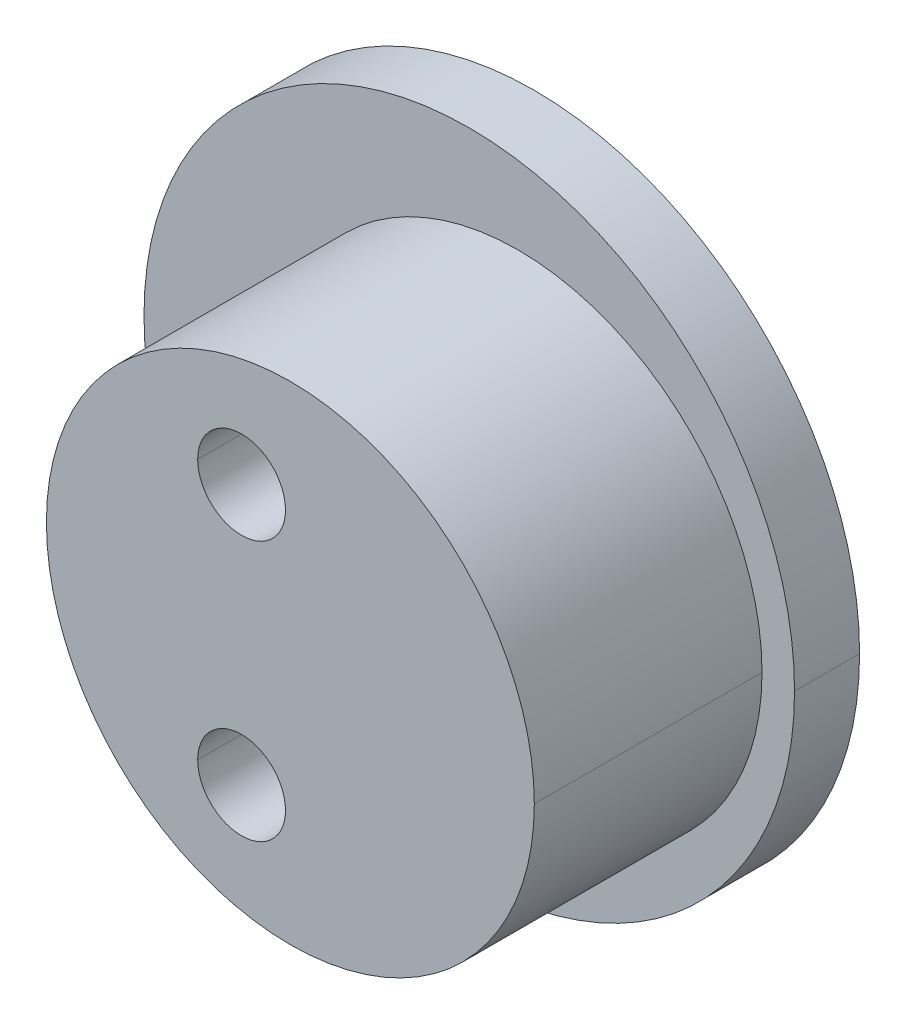
ISO-10303-21;
HEADER;
FILE_DESCRIPTION(('STEP AP214'),'2;1');
FILE_NAME('part.step','',(''),(''),'','','');
FILE_SCHEMA(('AUTOMOTIVE_DESIGN { 1 0 10303 214 1 1 1 1 }'));
ENDSEC;
DATA;
#1=APPLICATION_CONTEXT('core data for automotive mechanical design processes');
#2=APPLICATION_PROTOCOL_DEFINITION('international standard','automotive_design',2000,#1);
#3=PRODUCT_CONTEXT('',#1,'mechanical');
#4=PRODUCT('Part','Part','',(#3));
#5=PRODUCT_RELATED_PRODUCT_CATEGORY('part','',(#4));
#6=PRODUCT_DEFINITION_FORMATION('','',#4);
#7=PRODUCT_DEFINITION_CONTEXT('part definition',#1,'design');
#8=PRODUCT_DEFINITION('design','',#6,#7);
#9=PRODUCT_DEFINITION_SHAPE('','',#8);
#10=(LENGTH_UNIT() NAMED_UNIT(*) SI_UNIT(.MILLI.,.METRE.));
#11=(NAMED_UNIT(*) PLANE_ANGLE_UNIT() SI_UNIT($,.RADIAN.));
#12=(NAMED_UNIT(*) SI_UNIT($,.STERADIAN.) SOLID_ANGLE_UNIT());
#13=UNCERTAINTY_MEASURE_WITH_UNIT(LENGTH_MEASURE(1.E-05),#10,'distance_accuracy_value','');
#14=(GEOMETRIC_REPRESENTATION_CONTEXT(3) GLOBAL_UNCERTAINTY_ASSIGNED_CONTEXT((#13)) GLOBAL_UNIT_ASSIGNED_CONTEXT((#10,
#11,#12)) REPRESENTATION_CONTEXT('',''));
#15=CARTESIAN_POINT('',(0.,0.,0.));
#16=DIRECTION('',(0.,0.,1.));
#17=DIRECTION('',(1.,0.,0.));
#18=AXIS2_PLACEMENT_3D('',#15,#16,#17);
#19=CARTESIAN_POINT('',(0.,4.,0.));
#20=DIRECTION('',(0.,0.,1.));
#21=DIRECTION('',(1.,0.,0.));
#22=AXIS2_PLACEMENT_3D('',#19,#20,#21);
#23=CYLINDRICAL_SURFACE('',#22,1.35);
#24=DIRECTION('',(0.,0.,1.));
#25=VECTOR('',#24,1.);
#26=CARTESIAN_POINT('',(-1.35,4.,0.));
#27=LINE('',#26,#25);
#28=CARTESIAN_POINT('',(-1.35,4.,0.));
#29=VERTEX_POINT('',#28);
#30=CARTESIAN_POINT('',(-1.35,4.,9.));
#31=VERTEX_POINT('',#30);
#32=EDGE_CURVE('E132',#29,#31,#27,.T.);
#33=ORIENTED_EDGE('',*,*,#32,.F.);
#34=CARTESIAN_POINT('',(0.,4.,0.));
#35=DIRECTION('',(0.,0.,1.));
#36=DIRECTION('',(1.,0.,0.));
#37=AXIS2_PLACEMENT_3D('',#34,#35,#36);
#38=CIRCLE('',#37,1.35);
#39=CARTESIAN_POINT('',(1.35,4.,0.));
#40=VERTEX_POINT('',#39);
#41=EDGE_CURVE('E169',#40,#29,#38,.T.);
#42=ORIENTED_EDGE('',*,*,#41,.F.);
#43=DIRECTION('',(0.,0.,1.));
#44=VECTOR('',#43,1.);
#45=CARTESIAN_POINT('',(1.35,4.,0.));
#46=LINE('',#45,#44);
#47=CARTESIAN_POINT('',(1.35,4.,9.));
#48=VERTEX_POINT('',#47);
#49=EDGE_CURVE('E146',#40,#48,#46,.T.);
#50=ORIENTED_EDGE('',*,*,#49,.T.);
#51=CARTESIAN_POINT('',(0.,4.,9.));
#52=DIRECTION('',(0.,0.,1.));
#53=DIRECTION('',(1.,0.,0.));
#54=AXIS2_PLACEMENT_3D('',#51,#52,#53);
#55=CIRCLE('',#54,1.35);
#56=EDGE_CURVE('E27',#48,#31,#55,.T.);
#57=ORIENTED_EDGE('',*,*,#56,.T.);
#58=EDGE_LOOP('',(#33,#42,#50,#57));
#59=FACE_BOUND('',#58,.T.);
#60=ADVANCED_FACE('F17',(#59),#23,.F.);
#61=CARTESIAN_POINT('',(0.,-4.,0.));
#62=DIRECTION('',(0.,0.,1.));
#63=DIRECTION('',(1.,0.,0.));
#64=AXIS2_PLACEMENT_3D('',#61,#62,#63);
#65=CYLINDRICAL_SURFACE('',#64,1.35);
#66=DIRECTION('',(0.,0.,1.));
#67=VECTOR('',#66,1.);
#68=CARTESIAN_POINT('',(-1.35,-4.,0.));
#69=LINE('',#68,#67);
#70=CARTESIAN_POINT('',(-1.35,-4.,0.));
#71=VERTEX_POINT('',#70);
#72=CARTESIAN_POINT('',(-1.35,-4.,9.));
#73=VERTEX_POINT('',#72);
#74=EDGE_CURVE('E133',#71,#73,#69,.T.);
#75=ORIENTED_EDGE('',*,*,#74,.F.);
#76=CARTESIAN_POINT('',(0.,-4.,0.));
#77=DIRECTION('',(0.,0.,1.));
#78=DIRECTION('',(1.,0.,0.));
#79=AXIS2_PLACEMENT_3D('',#76,#77,#78);
#80=CIRCLE('',#79,1.35);
#81=CARTESIAN_POINT('',(1.35,-4.,0.));
#82=VERTEX_POINT('',#81);
#83=EDGE_CURVE('E165',#82,#71,#80,.T.);
#84=ORIENTED_EDGE('',*,*,#83,.F.);
#85=DIRECTION('',(0.,0.,1.));
#86=VECTOR('',#85,1.);
#87=CARTESIAN_POINT('',(1.35,-4.,0.));
#88=LINE('',#87,#86);
#89=CARTESIAN_POINT('',(1.35,-4.,9.));
#90=VERTEX_POINT('',#89);
#91=EDGE_CURVE('E156',#82,#90,#88,.T.);
#92=ORIENTED_EDGE('',*,*,#91,.T.);
#93=CARTESIAN_POINT('',(0.,-4.,9.));
#94=DIRECTION('',(0.,0.,1.));
#95=DIRECTION('',(1.,0.,0.));
#96=AXIS2_PLACEMENT_3D('',#93,#94,#95);
#97=CIRCLE('',#96,1.35);
#98=EDGE_CURVE('E11',#90,#73,#97,.T.);
#99=ORIENTED_EDGE('',*,*,#98,.T.);
#100=EDGE_LOOP('',(#75,#84,#92,#99));
#101=FACE_BOUND('',#100,.T.);
#102=ADVANCED_FACE('F19',(#101),#65,.F.);
#103=CARTESIAN_POINT('',(1.5,0.,9.));
#104=DIRECTION('',(0.,0.,1.));
#105=DIRECTION('',(1.,0.,0.));
#106=AXIS2_PLACEMENT_3D('',#103,#104,#105);
#107=PLANE('',#106);
#108=ORIENTED_EDGE('',*,*,#98,.F.);
#109=CARTESIAN_POINT('',(0.,-4.,9.));
#110=DIRECTION('',(0.,0.,1.));
#111=DIRECTION('',(1.,0.,0.));
#112=AXIS2_PLACEMENT_3D('',#109,#110,#111);
#113=CIRCLE('',#112,1.35);
#114=EDGE_CURVE('E137',#73,#90,#113,.T.);
#115=ORIENTED_EDGE('',*,*,#114,.F.);
#116=EDGE_LOOP('',(#108,#115));
#117=FACE_BOUND('',#116,.T.);
#118=ORIENTED_EDGE('',*,*,#56,.F.);
#119=CARTESIAN_POINT('',(0.,4.,9.));
#120=DIRECTION('',(0.,0.,1.));
#121=DIRECTION('',(1.,0.,0.));
#122=AXIS2_PLACEMENT_3D('',#119,#120,#121);
#123=CIRCLE('',#122,1.35);
#124=EDGE_CURVE('E142',#31,#48,#123,.T.);
#125=ORIENTED_EDGE('',*,*,#124,.F.);
#126=EDGE_LOOP('',(#118,#125));
#127=FACE_BOUND('',#126,.T.);
#128=CARTESIAN_POINT('',(1.5,0.,9.));
#129=DIRECTION('',(0.,0.,1.));
#130=DIRECTION('',(1.,0.,0.));
#131=AXIS2_PLACEMENT_3D('',#128,#129,#130);
#132=CIRCLE('',#131,7.5);
#133=CARTESIAN_POINT('',(-6.,0.,9.));
#134=VERTEX_POINT('',#133);
#135=CARTESIAN_POINT('',(9.,0.,9.));
#136=VERTEX_POINT('',#135);
#137=EDGE_CURVE('E168',#134,#136,#132,.T.);
#138=ORIENTED_EDGE('',*,*,#137,.T.);
#139=CARTESIAN_POINT('',(1.5,0.,9.));
#140=DIRECTION('',(0.,0.,1.));
#141=DIRECTION('',(1.,0.,0.));
#142=AXIS2_PLACEMENT_3D('',#139,#140,#141);
#143=CIRCLE('',#142,7.5);
#144=EDGE_CURVE('E160',#136,#134,#143,.T.);
#145=ORIENTED_EDGE('',*,*,#144,.T.);
#146=EDGE_LOOP('',(#138,#145));
#147=FACE_BOUND('',#146,.T.);
#148=ADVANCED_FACE('F196',(#117,#127,#147),#107,.T.);
#149=CARTESIAN_POINT('',(1.5,0.,9.));
#150=DIRECTION('',(0.,0.,-1.));
#151=DIRECTION('',(-1.,0.,0.));
#152=AXIS2_PLACEMENT_3D('',#149,#150,#151);
#153=CYLINDRICAL_SURFACE('',#152,7.5);
#154=DIRECTION('',(0.,0.,-1.));
#155=VECTOR('',#154,1.);
#156=CARTESIAN_POINT('',(9.,0.,9.));
#157=LINE('',#156,#155);
#158=CARTESIAN_POINT('',(9.,0.,2.));
#159=VERTEX_POINT('',#158);
#160=EDGE_CURVE('E164',#136,#159,#157,.T.);
#161=ORIENTED_EDGE('',*,*,#160,.F.);
#162=ORIENTED_EDGE('',*,*,#137,.F.);
#163=DIRECTION('',(0.,0.,-1.));
#164=VECTOR('',#163,1.);
#165=CARTESIAN_POINT('',(-6.,0.,9.));
#166=LINE('',#165,#164);
#167=CARTESIAN_POINT('',(-6.,0.,2.));
#168=VERTEX_POINT('',#167);
#169=EDGE_CURVE('E117',#134,#168,#166,.T.);
#170=ORIENTED_EDGE('',*,*,#169,.T.);
#171=CARTESIAN_POINT('',(1.5,0.,2.));
#172=DIRECTION('',(0.,0.,1.));
#173=DIRECTION('',(1.,0.,0.));
#174=AXIS2_PLACEMENT_3D('',#171,#172,#173);
#175=CIRCLE('',#174,7.5);
#176=EDGE_CURVE('E180',#168,#159,#175,.T.);
#177=ORIENTED_EDGE('',*,*,#176,.T.);
#178=EDGE_LOOP('',(#161,#162,#170,#177));
#179=FACE_BOUND('',#178,.T.);
#180=ADVANCED_FACE('F203',(#179),#153,.T.);
#181=CARTESIAN_POINT('',(0.,0.,0.));
#182=DIRECTION('',(0.,0.,1.));
#183=DIRECTION('',(1.,0.,0.));
#184=AXIS2_PLACEMENT_3D('',#181,#182,#183);
#185=PLANE('',#184);
#186=ORIENTED_EDGE('',*,*,#83,.T.);
#187=CARTESIAN_POINT('',(0.,-4.,0.));
#188=DIRECTION('',(0.,0.,1.));
#189=DIRECTION('',(1.,0.,0.));
#190=AXIS2_PLACEMENT_3D('',#187,#188,#189);
#191=CIRCLE('',#190,1.35);
#192=EDGE_CURVE('E138',#71,#82,#191,.T.);
#193=ORIENTED_EDGE('',*,*,#192,.T.);
#194=EDGE_LOOP('',(#186,#193));
#195=FACE_BOUND('',#194,.T.);
#196=ORIENTED_EDGE('',*,*,#41,.T.);
#197=CARTESIAN_POINT('',(0.,4.,0.));
#198=DIRECTION('',(0.,0.,1.));
#199=DIRECTION('',(1.,0.,0.));
#200=AXIS2_PLACEMENT_3D('',#197,#198,#199);
#201=CIRCLE('',#200,1.35);
#202=EDGE_CURVE('E128',#29,#40,#201,.T.);
#203=ORIENTED_EDGE('',*,*,#202,.T.);
#204=EDGE_LOOP('',(#196,#203));
#205=FACE_BOUND('',#204,.T.);
#206=CARTESIAN_POINT('',(0.,0.,0.));
#207=DIRECTION('',(0.,0.,1.));
#208=DIRECTION('',(1.,0.,0.));
#209=AXIS2_PLACEMENT_3D('',#206,#207,#208);
#210=CIRCLE('',#209,10.);
#211=CARTESIAN_POINT('',(-10.,0.,0.));
#212=VERTEX_POINT('',#211);
#213=CARTESIAN_POINT('',(10.,0.,0.));
#214=VERTEX_POINT('',#213);
#215=EDGE_CURVE('E39',#212,#214,#210,.T.);
#216=ORIENTED_EDGE('',*,*,#215,.F.);
#217=CARTESIAN_POINT('',(0.,0.,0.));
#218=DIRECTION('',(0.,0.,1.));
#219=DIRECTION('',(1.,0.,0.));
#220=AXIS2_PLACEMENT_3D('',#217,#218,#219);
#221=CIRCLE('',#220,10.);
#222=EDGE_CURVE('E113',#214,#212,#221,.T.);
#223=ORIENTED_EDGE('',*,*,#222,.F.);
#224=EDGE_LOOP('',(#216,#223));
#225=FACE_BOUND('',#224,.T.);
#226=ADVANCED_FACE('F201',(#195,#205,#225),#185,.F.);
#227=CARTESIAN_POINT('',(0.,0.,2.));
#228=DIRECTION('',(0.,0.,1.));
#229=DIRECTION('',(1.,0.,0.));
#230=AXIS2_PLACEMENT_3D('',#227,#228,#229);
#231=PLANE('',#230);
#232=ORIENTED_EDGE('',*,*,#176,.F.);
#233=CARTESIAN_POINT('',(1.5,0.,2.));
#234=DIRECTION('',(0.,0.,1.));
#235=DIRECTION('',(1.,0.,0.));
#236=AXIS2_PLACEMENT_3D('',#233,#234,#235);
#237=CIRCLE('',#236,7.5);
#238=EDGE_CURVE('E124',#159,#168,#237,.T.);
#239=ORIENTED_EDGE('',*,*,#238,.F.);
#240=EDGE_LOOP('',(#232,#239));
#241=FACE_BOUND('',#240,.T.);
#242=CARTESIAN_POINT('',(0.,0.,2.));
#243=DIRECTION('',(0.,0.,1.));
#244=DIRECTION('',(1.,0.,0.));
#245=AXIS2_PLACEMENT_3D('',#242,#243,#244);
#246=CIRCLE('',#245,10.);
#247=CARTESIAN_POINT('',(-10.,0.,2.));
#248=VERTEX_POINT('',#247);
#249=CARTESIAN_POINT('',(10.,0.,2.));
#250=VERTEX_POINT('',#249);
#251=EDGE_CURVE('E97',#248,#250,#246,.T.);
#252=ORIENTED_EDGE('',*,*,#251,.T.);
#253=CARTESIAN_POINT('',(0.,0.,2.));
#254=DIRECTION('',(0.,0.,1.));
#255=DIRECTION('',(1.,0.,0.));
#256=AXIS2_PLACEMENT_3D('',#253,#254,#255);
#257=CIRCLE('',#256,10.);
#258=EDGE_CURVE('E101',#250,#248,#257,.T.);
#259=ORIENTED_EDGE('',*,*,#258,.T.);
#260=EDGE_LOOP('',(#252,#259));
#261=FACE_BOUND('',#260,.T.);
#262=ADVANCED_FACE('F99',(#241,#261),#231,.T.);
#263=CARTESIAN_POINT('',(0.,0.,2.));
#264=DIRECTION('',(0.,0.,-1.));
#265=DIRECTION('',(-1.,0.,0.));
#266=AXIS2_PLACEMENT_3D('',#263,#264,#265);
#267=CYLINDRICAL_SURFACE('',#266,10.);
#268=DIRECTION('',(0.,0.,-1.));
#269=VECTOR('',#268,1.);
#270=CARTESIAN_POINT('',(10.,0.,2.));
#271=LINE('',#270,#269);
#272=EDGE_CURVE('E108',#250,#214,#271,.T.);
#273=ORIENTED_EDGE('',*,*,#272,.F.);
#274=ORIENTED_EDGE('',*,*,#251,.F.);
#275=DIRECTION('',(0.,0.,-1.));
#276=VECTOR('',#275,1.);
#277=CARTESIAN_POINT('',(-10.,0.,2.));
#278=LINE('',#277,#276);
#279=EDGE_CURVE('E105',#248,#212,#278,.T.);
#280=ORIENTED_EDGE('',*,*,#279,.T.);
#281=ORIENTED_EDGE('',*,*,#215,.T.);
#282=EDGE_LOOP('',(#273,#274,#280,#281));
#283=FACE_BOUND('',#282,.T.);
#284=ADVANCED_FACE('F109',(#283),#267,.T.);
#285=CARTESIAN_POINT('',(0.,0.,2.));
#286=DIRECTION('',(0.,0.,-1.));
#287=DIRECTION('',(-1.,0.,0.));
#288=AXIS2_PLACEMENT_3D('',#285,#286,#287);
#289=CYLINDRICAL_SURFACE('',#288,10.);
#290=ORIENTED_EDGE('',*,*,#258,.F.);
#291=ORIENTED_EDGE('',*,*,#272,.T.);
#292=ORIENTED_EDGE('',*,*,#222,.T.);
#293=ORIENTED_EDGE('',*,*,#279,.F.);
#294=EDGE_LOOP('',(#290,#291,#292,#293));
#295=FACE_BOUND('',#294,.T.);
#296=ADVANCED_FACE('F115',(#295),#289,.T.);
#297=CARTESIAN_POINT('',(1.5,0.,9.));
#298=DIRECTION('',(0.,0.,-1.));
#299=DIRECTION('',(-1.,0.,0.));
#300=AXIS2_PLACEMENT_3D('',#297,#298,#299);
#301=CYLINDRICAL_SURFACE('',#300,7.5);
#302=ORIENTED_EDGE('',*,*,#144,.F.);
#303=ORIENTED_EDGE('',*,*,#160,.T.);
#304=ORIENTED_EDGE('',*,*,#238,.T.);
#305=ORIENTED_EDGE('',*,*,#169,.F.);
#306=EDGE_LOOP('',(#302,#303,#304,#305));
#307=FACE_BOUND('',#306,.T.);
#308=ADVANCED_FACE('F229',(#307),#301,.T.);
#309=CARTESIAN_POINT('',(0.,-4.,0.));
#310=DIRECTION('',(0.,0.,1.));
#311=DIRECTION('',(1.,0.,0.));
#312=AXIS2_PLACEMENT_3D('',#309,#310,#311);
#313=CYLINDRICAL_SURFACE('',#312,1.35);
#314=ORIENTED_EDGE('',*,*,#192,.F.);
#315=ORIENTED_EDGE('',*,*,#74,.T.);
#316=ORIENTED_EDGE('',*,*,#114,.T.);
#317=ORIENTED_EDGE('',*,*,#91,.F.);
#318=EDGE_LOOP('',(#314,#315,#316,#317));
#319=FACE_BOUND('',#318,.T.);
#320=ADVANCED_FACE('F231',(#319),#313,.F.);
#321=CARTESIAN_POINT('',(0.,4.,0.));
#322=DIRECTION('',(0.,0.,1.));
#323=DIRECTION('',(1.,0.,0.));
#324=AXIS2_PLACEMENT_3D('',#321,#322,#323);
#325=CYLINDRICAL_SURFACE('',#324,1.35);
#326=ORIENTED_EDGE('',*,*,#202,.F.);
#327=ORIENTED_EDGE('',*,*,#32,.T.);
#328=ORIENTED_EDGE('',*,*,#124,.T.);
#329=ORIENTED_EDGE('',*,*,#49,.F.);
#330=EDGE_LOOP('',(#326,#327,#328,#329));
#331=FACE_BOUND('',#330,.T.);
#332=ADVANCED_FACE('F199',(#331),#325,.F.);
#333=CLOSED_SHELL('',(#60,#102,#148,#180,#226,#262,#284,#296,#308,#320,#332));
#334=MANIFOLD_SOLID_BREP('B1',#333);
#335=ADVANCED_BREP_SHAPE_REPRESENTATION('',(#18,#334),#14);
#336=SHAPE_DEFINITION_REPRESENTATION(#9,#335);
ENDSEC;
END-ISO-10303-21;
